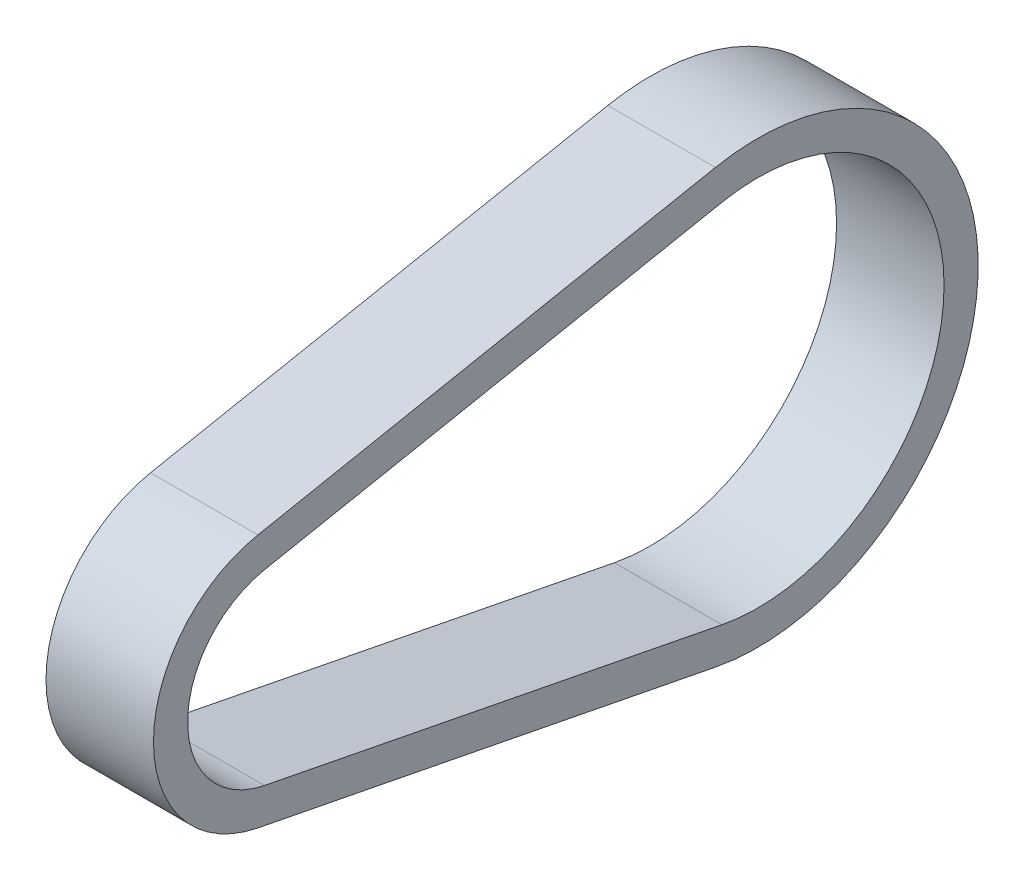
ISO-10303-21;
HEADER;
FILE_DESCRIPTION(('STEP AP214'),'2;1');
FILE_NAME('part.step','',(''),(''),'','','');
FILE_SCHEMA(('AUTOMOTIVE_DESIGN { 1 0 10303 214 1 1 1 1 }'));
ENDSEC;
DATA;
#1=APPLICATION_CONTEXT('core data for automotive mechanical design processes');
#2=APPLICATION_PROTOCOL_DEFINITION('international standard','automotive_design',2000,#1);
#3=PRODUCT_CONTEXT('',#1,'mechanical');
#4=PRODUCT('Part','Part','',(#3));
#5=PRODUCT_RELATED_PRODUCT_CATEGORY('part','',(#4));
#6=PRODUCT_DEFINITION_FORMATION('','',#4);
#7=PRODUCT_DEFINITION_CONTEXT('part definition',#1,'design');
#8=PRODUCT_DEFINITION('design','',#6,#7);
#9=PRODUCT_DEFINITION_SHAPE('','',#8);
#10=(LENGTH_UNIT() NAMED_UNIT(*) SI_UNIT(.MILLI.,.METRE.));
#11=(NAMED_UNIT(*) PLANE_ANGLE_UNIT() SI_UNIT($,.RADIAN.));
#12=(NAMED_UNIT(*) SI_UNIT($,.STERADIAN.) SOLID_ANGLE_UNIT());
#13=UNCERTAINTY_MEASURE_WITH_UNIT(LENGTH_MEASURE(1.E-05),#10,'distance_accuracy_value','');
#14=(GEOMETRIC_REPRESENTATION_CONTEXT(3) GLOBAL_UNCERTAINTY_ASSIGNED_CONTEXT((#13)) GLOBAL_UNIT_ASSIGNED_CONTEXT((#10,
#11,#12)) REPRESENTATION_CONTEXT('',''));
#15=CARTESIAN_POINT('',(0.,0.,0.));
#16=DIRECTION('',(0.,0.,1.));
#17=DIRECTION('',(1.,0.,0.));
#18=AXIS2_PLACEMENT_3D('',#15,#16,#17);
#19=CARTESIAN_POINT('',(7.5,0.,0.));
#20=DIRECTION('',(1.,0.,0.));
#21=DIRECTION('',(0.,0.,-1.));
#22=AXIS2_PLACEMENT_3D('',#19,#20,#21);
#23=PLANE('',#22);
#24=CARTESIAN_POINT('',(7.5,0.,0.));
#25=DIRECTION('',(1.,0.,0.));
#26=DIRECTION('',(0.,0.,-1.));
#27=AXIS2_PLACEMENT_3D('',#24,#25,#26);
#28=CIRCLE('',#27,18.0467);
#29=CARTESIAN_POINT('',(7.5,17.7108943362631,3.465198796566));
#30=VERTEX_POINT('',#29);
#31=CARTESIAN_POINT('',(7.5,-17.7108943362631,3.465198796566));
#32=VERTEX_POINT('',#31);
#33=EDGE_CURVE('E140',#30,#32,#28,.T.);
#34=ORIENTED_EDGE('',*,*,#33,.T.);
#35=DIRECTION('',(0.,-0.192012877510348,-0.981392406160857));
#36=VECTOR('',#35,1.);
#37=CARTESIAN_POINT('',(7.5,-17.7108943362631,3.465198796566));
#38=LINE('',#37,#36);
#39=CARTESIAN_POINT('',(7.5,-30.1995052616225,-60.3650405319638));
#40=VERTEX_POINT('',#39);
#41=EDGE_CURVE('E143',#32,#40,#38,.T.);
#42=ORIENTED_EDGE('',*,*,#41,.T.);
#43=CARTESIAN_POINT('',(7.5,0.,-66.27368));
#44=DIRECTION('',(1.,0.,0.));
#45=DIRECTION('',(0.,0.,-1.));
#46=AXIS2_PLACEMENT_3D('',#43,#44,#45);
#47=CIRCLE('',#46,30.7721);
#48=CARTESIAN_POINT('',(7.5,30.1995052616225,-60.3650405319638));
#49=VERTEX_POINT('',#48);
#50=EDGE_CURVE('E146',#40,#49,#47,.T.);
#51=ORIENTED_EDGE('',*,*,#50,.T.);
#52=DIRECTION('',(0.,-0.192012877510348,0.981392406160857));
#53=VECTOR('',#52,1.);
#54=CARTESIAN_POINT('',(7.5,17.7108943362631,3.465198796566));
#55=LINE('',#54,#53);
#56=EDGE_CURVE('E148',#49,#30,#55,.T.);
#57=ORIENTED_EDGE('',*,*,#56,.T.);
#58=EDGE_LOOP('',(#34,#42,#51,#57));
#59=FACE_BOUND('',#58,.T.);
#60=DIRECTION('',(0.,-0.192012877510348,-0.981392406160857));
#61=VECTOR('',#60,1.);
#62=CARTESIAN_POINT('',(7.5,-13.0370130019221,2.55073746742297));
#63=LINE('',#62,#61);
#64=CARTESIAN_POINT('',(7.5,-13.0370130019221,2.55073746742297));
#65=VERTEX_POINT('',#64);
#66=CARTESIAN_POINT('',(7.5,-25.5256239272814,-61.2795018611068));
#67=VERTEX_POINT('',#66);
#68=EDGE_CURVE('E112',#65,#67,#63,.T.);
#69=ORIENTED_EDGE('',*,*,#68,.F.);
#70=CARTESIAN_POINT('',(7.5,0.,0.));
#71=DIRECTION('',(1.,0.,0.));
#72=DIRECTION('',(0.,0.,-1.));
#73=AXIS2_PLACEMENT_3D('',#70,#71,#72);
#74=CIRCLE('',#73,13.2842);
#75=CARTESIAN_POINT('',(7.5,13.0370130019221,2.55073746742297));
#76=VERTEX_POINT('',#75);
#77=EDGE_CURVE('E104',#76,#65,#74,.T.);
#78=ORIENTED_EDGE('',*,*,#77,.F.);
#79=DIRECTION('',(0.,-0.192012877510348,0.981392406160857));
#80=VECTOR('',#79,1.);
#81=CARTESIAN_POINT('',(7.5,13.0370130019221,2.55073746742297));
#82=LINE('',#81,#80);
#83=CARTESIAN_POINT('',(7.5,25.5256239272814,-61.2795018611068));
#84=VERTEX_POINT('',#83);
#85=EDGE_CURVE('E126',#84,#76,#82,.T.);
#86=ORIENTED_EDGE('',*,*,#85,.F.);
#87=CARTESIAN_POINT('',(7.5,0.,-66.27368));
#88=DIRECTION('',(1.,0.,0.));
#89=DIRECTION('',(0.,0.,-1.));
#90=AXIS2_PLACEMENT_3D('',#87,#88,#89);
#91=CIRCLE('',#90,26.0096);
#92=EDGE_CURVE('E124',#67,#84,#91,.T.);
#93=ORIENTED_EDGE('',*,*,#92,.F.);
#94=EDGE_LOOP('',(#69,#78,#86,#93));
#95=FACE_BOUND('',#94,.T.);
#96=ADVANCED_FACE('F39',(#59,#95),#23,.T.);
#97=CARTESIAN_POINT('',(-7.5,0.,0.));
#98=DIRECTION('',(1.,0.,0.));
#99=DIRECTION('',(0.,0.,-1.));
#100=AXIS2_PLACEMENT_3D('',#97,#98,#99);
#101=PLANE('',#100);
#102=CARTESIAN_POINT('',(-7.5,0.,0.));
#103=DIRECTION('',(1.,0.,0.));
#104=DIRECTION('',(0.,0.,-1.));
#105=AXIS2_PLACEMENT_3D('',#102,#103,#104);
#106=CIRCLE('',#105,18.0467);
#107=CARTESIAN_POINT('',(-7.5,17.7108943362631,3.465198796566));
#108=VERTEX_POINT('',#107);
#109=CARTESIAN_POINT('',(-7.5,-17.7108943362631,3.465198796566));
#110=VERTEX_POINT('',#109);
#111=EDGE_CURVE('E120',#108,#110,#106,.T.);
#112=ORIENTED_EDGE('',*,*,#111,.F.);
#113=DIRECTION('',(0.,-0.192012877510348,0.981392406160857));
#114=VECTOR('',#113,1.);
#115=CARTESIAN_POINT('',(-7.5,17.7108943362631,3.465198796566));
#116=LINE('',#115,#114);
#117=CARTESIAN_POINT('',(-7.5,30.1995052616225,-60.3650405319638));
#118=VERTEX_POINT('',#117);
#119=EDGE_CURVE('E144',#118,#108,#116,.T.);
#120=ORIENTED_EDGE('',*,*,#119,.F.);
#121=CARTESIAN_POINT('',(-7.5,0.,-66.27368));
#122=DIRECTION('',(1.,0.,0.));
#123=DIRECTION('',(0.,0.,-1.));
#124=AXIS2_PLACEMENT_3D('',#121,#122,#123);
#125=CIRCLE('',#124,30.7721);
#126=CARTESIAN_POINT('',(-7.5,-30.1995052616225,-60.3650405319638));
#127=VERTEX_POINT('',#126);
#128=EDGE_CURVE('E155',#127,#118,#125,.T.);
#129=ORIENTED_EDGE('',*,*,#128,.F.);
#130=DIRECTION('',(0.,-0.192012877510348,-0.981392406160857));
#131=VECTOR('',#130,1.);
#132=CARTESIAN_POINT('',(-7.5,-17.7108943362631,3.465198796566));
#133=LINE('',#132,#131);
#134=EDGE_CURVE('E153',#110,#127,#133,.T.);
#135=ORIENTED_EDGE('',*,*,#134,.F.);
#136=EDGE_LOOP('',(#112,#120,#129,#135));
#137=FACE_BOUND('',#136,.T.);
#138=CARTESIAN_POINT('',(-7.5,0.,0.));
#139=DIRECTION('',(1.,0.,0.));
#140=DIRECTION('',(0.,0.,-1.));
#141=AXIS2_PLACEMENT_3D('',#138,#139,#140);
#142=CIRCLE('',#141,13.2842);
#143=CARTESIAN_POINT('',(-7.5,13.0370130019221,2.55073746742297));
#144=VERTEX_POINT('',#143);
#145=CARTESIAN_POINT('',(-7.5,-13.0370130019221,2.55073746742297));
#146=VERTEX_POINT('',#145);
#147=EDGE_CURVE('E62',#144,#146,#142,.T.);
#148=ORIENTED_EDGE('',*,*,#147,.T.);
#149=DIRECTION('',(0.,-0.192012877510348,-0.981392406160857));
#150=VECTOR('',#149,1.);
#151=CARTESIAN_POINT('',(-7.5,-13.0370130019221,2.55073746742297));
#152=LINE('',#151,#150);
#153=CARTESIAN_POINT('',(-7.5,-25.5256239272814,-61.2795018611068));
#154=VERTEX_POINT('',#153);
#155=EDGE_CURVE('E119',#146,#154,#152,.T.);
#156=ORIENTED_EDGE('',*,*,#155,.T.);
#157=CARTESIAN_POINT('',(-7.5,0.,-66.27368));
#158=DIRECTION('',(1.,0.,0.));
#159=DIRECTION('',(0.,0.,-1.));
#160=AXIS2_PLACEMENT_3D('',#157,#158,#159);
#161=CIRCLE('',#160,26.0096);
#162=CARTESIAN_POINT('',(-7.5,25.5256239272814,-61.2795018611068));
#163=VERTEX_POINT('',#162);
#164=EDGE_CURVE('E132',#154,#163,#161,.T.);
#165=ORIENTED_EDGE('',*,*,#164,.T.);
#166=DIRECTION('',(0.,-0.192012877510348,0.981392406160857));
#167=VECTOR('',#166,1.);
#168=CARTESIAN_POINT('',(-7.5,13.0370130019221,2.55073746742297));
#169=LINE('',#168,#167);
#170=EDGE_CURVE('E113',#163,#144,#169,.T.);
#171=ORIENTED_EDGE('',*,*,#170,.T.);
#172=EDGE_LOOP('',(#148,#156,#165,#171));
#173=FACE_BOUND('',#172,.T.);
#174=ADVANCED_FACE('F173',(#137,#173),#101,.F.);
#175=CARTESIAN_POINT('',(7.5,0.,0.));
#176=DIRECTION('',(-1.,0.,0.));
#177=DIRECTION('',(0.,0.,1.));
#178=AXIS2_PLACEMENT_3D('',#175,#176,#177);
#179=CYLINDRICAL_SURFACE('',#178,18.0467);
#180=ORIENTED_EDGE('',*,*,#111,.T.);
#181=DIRECTION('',(-1.,0.,0.));
#182=VECTOR('',#181,1.);
#183=CARTESIAN_POINT('',(7.5,-17.7108943362631,3.465198796566));
#184=LINE('',#183,#182);
#185=EDGE_CURVE('E11',#32,#110,#184,.T.);
#186=ORIENTED_EDGE('',*,*,#185,.F.);
#187=ORIENTED_EDGE('',*,*,#33,.F.);
#188=DIRECTION('',(-1.,0.,0.));
#189=VECTOR('',#188,1.);
#190=CARTESIAN_POINT('',(7.5,17.7108943362631,3.465198796566));
#191=LINE('',#190,#189);
#192=EDGE_CURVE('E150',#30,#108,#191,.T.);
#193=ORIENTED_EDGE('',*,*,#192,.T.);
#194=EDGE_LOOP('',(#180,#186,#187,#193));
#195=FACE_BOUND('',#194,.T.);
#196=ADVANCED_FACE('F41',(#195),#179,.T.);
#197=CARTESIAN_POINT('',(7.5,-17.7108943362631,3.465198796566));
#198=DIRECTION('',(0.,0.981392406160857,-0.192012877510348));
#199=DIRECTION('',(0.,0.192012877510348,0.981392406160857));
#200=AXIS2_PLACEMENT_3D('',#197,#198,#199);
#201=PLANE('',#200);
#202=ORIENTED_EDGE('',*,*,#134,.T.);
#203=DIRECTION('',(-1.,0.,0.));
#204=VECTOR('',#203,1.);
#205=CARTESIAN_POINT('',(7.5,-30.1995052616225,-60.3650405319638));
#206=LINE('',#205,#204);
#207=EDGE_CURVE('E47',#40,#127,#206,.T.);
#208=ORIENTED_EDGE('',*,*,#207,.F.);
#209=ORIENTED_EDGE('',*,*,#41,.F.);
#210=ORIENTED_EDGE('',*,*,#185,.T.);
#211=EDGE_LOOP('',(#202,#208,#209,#210));
#212=FACE_BOUND('',#211,.T.);
#213=ADVANCED_FACE('F183',(#212),#201,.F.);
#214=CARTESIAN_POINT('',(7.5,0.,-66.27368));
#215=DIRECTION('',(-1.,0.,0.));
#216=DIRECTION('',(0.,0.,1.));
#217=AXIS2_PLACEMENT_3D('',#214,#215,#216);
#218=CYLINDRICAL_SURFACE('',#217,30.7721);
#219=ORIENTED_EDGE('',*,*,#128,.T.);
#220=DIRECTION('',(-1.,0.,0.));
#221=VECTOR('',#220,1.);
#222=CARTESIAN_POINT('',(7.5,30.1995052616225,-60.3650405319638));
#223=LINE('',#222,#221);
#224=EDGE_CURVE('E160',#49,#118,#223,.T.);
#225=ORIENTED_EDGE('',*,*,#224,.F.);
#226=ORIENTED_EDGE('',*,*,#50,.F.);
#227=ORIENTED_EDGE('',*,*,#207,.T.);
#228=EDGE_LOOP('',(#219,#225,#226,#227));
#229=FACE_BOUND('',#228,.T.);
#230=ADVANCED_FACE('F167',(#229),#218,.T.);
#231=CARTESIAN_POINT('',(7.5,17.7108943362631,3.465198796566));
#232=DIRECTION('',(0.,-0.981392406160857,-0.192012877510348));
#233=DIRECTION('',(0.,0.192012877510348,-0.981392406160857));
#234=AXIS2_PLACEMENT_3D('',#231,#232,#233);
#235=PLANE('',#234);
#236=ORIENTED_EDGE('',*,*,#119,.T.);
#237=ORIENTED_EDGE('',*,*,#192,.F.);
#238=ORIENTED_EDGE('',*,*,#56,.F.);
#239=ORIENTED_EDGE('',*,*,#224,.T.);
#240=EDGE_LOOP('',(#236,#237,#238,#239));
#241=FACE_BOUND('',#240,.T.);
#242=ADVANCED_FACE('F177',(#241),#235,.F.);
#243=CARTESIAN_POINT('',(7.5,0.,0.));
#244=DIRECTION('',(-1.,0.,0.));
#245=DIRECTION('',(0.,0.,1.));
#246=AXIS2_PLACEMENT_3D('',#243,#244,#245);
#247=CYLINDRICAL_SURFACE('',#246,13.2842);
#248=ORIENTED_EDGE('',*,*,#147,.F.);
#249=DIRECTION('',(-1.,0.,0.));
#250=VECTOR('',#249,1.);
#251=CARTESIAN_POINT('',(7.5,13.0370130019221,2.55073746742297));
#252=LINE('',#251,#250);
#253=EDGE_CURVE('E108',#76,#144,#252,.T.);
#254=ORIENTED_EDGE('',*,*,#253,.F.);
#255=ORIENTED_EDGE('',*,*,#77,.T.);
#256=DIRECTION('',(-1.,0.,0.));
#257=VECTOR('',#256,1.);
#258=CARTESIAN_POINT('',(7.5,-13.0370130019221,2.55073746742297));
#259=LINE('',#258,#257);
#260=EDGE_CURVE('E107',#65,#146,#259,.T.);
#261=ORIENTED_EDGE('',*,*,#260,.T.);
#262=EDGE_LOOP('',(#248,#254,#255,#261));
#263=FACE_BOUND('',#262,.T.);
#264=ADVANCED_FACE('F106',(#263),#247,.F.);
#265=CARTESIAN_POINT('',(7.5,-13.0370130019221,2.55073746742297));
#266=DIRECTION('',(0.,0.981392406160857,-0.192012877510348));
#267=DIRECTION('',(0.,0.192012877510348,0.981392406160857));
#268=AXIS2_PLACEMENT_3D('',#265,#266,#267);
#269=PLANE('',#268);
#270=ORIENTED_EDGE('',*,*,#155,.F.);
#271=ORIENTED_EDGE('',*,*,#260,.F.);
#272=ORIENTED_EDGE('',*,*,#68,.T.);
#273=DIRECTION('',(-1.,0.,0.));
#274=VECTOR('',#273,1.);
#275=CARTESIAN_POINT('',(7.5,-25.5256239272814,-61.2795018611068));
#276=LINE('',#275,#274);
#277=EDGE_CURVE('E121',#67,#154,#276,.T.);
#278=ORIENTED_EDGE('',*,*,#277,.T.);
#279=EDGE_LOOP('',(#270,#271,#272,#278));
#280=FACE_BOUND('',#279,.T.);
#281=ADVANCED_FACE('F116',(#280),#269,.T.);
#282=CARTESIAN_POINT('',(7.5,0.,-66.27368));
#283=DIRECTION('',(-1.,0.,0.));
#284=DIRECTION('',(0.,0.,1.));
#285=AXIS2_PLACEMENT_3D('',#282,#283,#284);
#286=CYLINDRICAL_SURFACE('',#285,26.0096);
#287=ORIENTED_EDGE('',*,*,#164,.F.);
#288=ORIENTED_EDGE('',*,*,#277,.F.);
#289=ORIENTED_EDGE('',*,*,#92,.T.);
#290=DIRECTION('',(-1.,0.,0.));
#291=VECTOR('',#290,1.);
#292=CARTESIAN_POINT('',(7.5,25.5256239272814,-61.2795018611068));
#293=LINE('',#292,#291);
#294=EDGE_CURVE('E54',#84,#163,#293,.T.);
#295=ORIENTED_EDGE('',*,*,#294,.T.);
#296=EDGE_LOOP('',(#287,#288,#289,#295));
#297=FACE_BOUND('',#296,.T.);
#298=ADVANCED_FACE('F206',(#297),#286,.F.);
#299=CARTESIAN_POINT('',(7.5,13.0370130019221,2.55073746742297));
#300=DIRECTION('',(0.,-0.981392406160857,-0.192012877510348));
#301=DIRECTION('',(0.,0.192012877510348,-0.981392406160857));
#302=AXIS2_PLACEMENT_3D('',#299,#300,#301);
#303=PLANE('',#302);
#304=ORIENTED_EDGE('',*,*,#170,.F.);
#305=ORIENTED_EDGE('',*,*,#294,.F.);
#306=ORIENTED_EDGE('',*,*,#85,.T.);
#307=ORIENTED_EDGE('',*,*,#253,.T.);
#308=EDGE_LOOP('',(#304,#305,#306,#307));
#309=FACE_BOUND('',#308,.T.);
#310=ADVANCED_FACE('F210',(#309),#303,.T.);
#311=CLOSED_SHELL('',(#96,#174,#196,#213,#230,#242,#264,#281,#298,#310));
#312=MANIFOLD_SOLID_BREP('B2',#311);
#313=ADVANCED_BREP_SHAPE_REPRESENTATION('',(#18,#312),#14);
#314=SHAPE_DEFINITION_REPRESENTATION(#9,#313);
ENDSEC;
END-ISO-10303-21;
